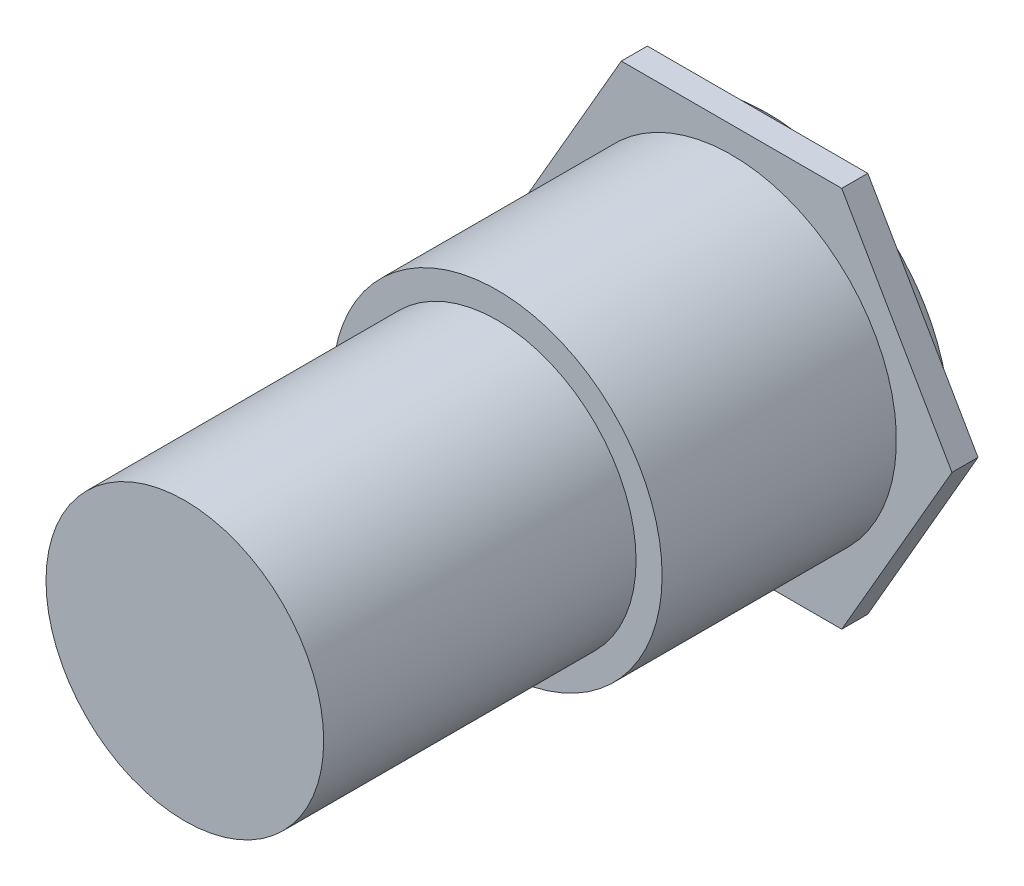
ISO-10303-21;
HEADER;
FILE_DESCRIPTION(('STEP AP214'),'2;1');
FILE_NAME('part.step','',(''),(''),'','','');
FILE_SCHEMA(('AUTOMOTIVE_DESIGN { 1 0 10303 214 1 1 1 1 }'));
ENDSEC;
DATA;
#1=APPLICATION_CONTEXT('core data for automotive mechanical design processes');
#2=APPLICATION_PROTOCOL_DEFINITION('international standard','automotive_design',2000,#1);
#3=PRODUCT_CONTEXT('',#1,'mechanical');
#4=PRODUCT('Part','Part','',(#3));
#5=PRODUCT_RELATED_PRODUCT_CATEGORY('part','',(#4));
#6=PRODUCT_DEFINITION_FORMATION('','',#4);
#7=PRODUCT_DEFINITION_CONTEXT('part definition',#1,'design');
#8=PRODUCT_DEFINITION('design','',#6,#7);
#9=PRODUCT_DEFINITION_SHAPE('','',#8);
#10=(LENGTH_UNIT() NAMED_UNIT(*) SI_UNIT(.MILLI.,.METRE.));
#11=(NAMED_UNIT(*) PLANE_ANGLE_UNIT() SI_UNIT($,.RADIAN.));
#12=(NAMED_UNIT(*) SI_UNIT($,.STERADIAN.) SOLID_ANGLE_UNIT());
#13=UNCERTAINTY_MEASURE_WITH_UNIT(LENGTH_MEASURE(1.E-05),#10,'distance_accuracy_value','');
#14=(GEOMETRIC_REPRESENTATION_CONTEXT(3) GLOBAL_UNCERTAINTY_ASSIGNED_CONTEXT((#13)) GLOBAL_UNIT_ASSIGNED_CONTEXT((#10,
#11,#12)) REPRESENTATION_CONTEXT('',''));
#15=CARTESIAN_POINT('',(0.,0.,0.));
#16=DIRECTION('',(0.,0.,1.));
#17=DIRECTION('',(1.,0.,0.));
#18=AXIS2_PLACEMENT_3D('',#15,#16,#17);
#19=CARTESIAN_POINT('',(0.,0.,0.));
#20=DIRECTION('',(0.,0.,1.));
#21=DIRECTION('',(1.,0.,0.));
#22=AXIS2_PLACEMENT_3D('',#19,#20,#21);
#23=PLANE('',#22);
#24=DIRECTION('',(0.5,-0.866025403784439,0.));
#25=VECTOR('',#24,1.);
#26=CARTESIAN_POINT('',(6.35085296108588,11.,0.));
#27=LINE('',#26,#25);
#28=CARTESIAN_POINT('',(6.35085296108588,11.,0.));
#29=VERTEX_POINT('',#28);
#30=CARTESIAN_POINT('',(9.52627944162882,5.49999999999999,0.));
#31=VERTEX_POINT('',#30);
#32=EDGE_CURVE('E154',#29,#31,#27,.T.);
#33=ORIENTED_EDGE('',*,*,#32,.T.);
#34=CARTESIAN_POINT('',(0.,0.,0.));
#35=DIRECTION('',(0.,0.,1.));
#36=DIRECTION('',(1.,0.,0.));
#37=AXIS2_PLACEMENT_3D('',#34,#35,#36);
#38=CIRCLE('',#37,11.);
#39=CARTESIAN_POINT('',(0.,11.,0.));
#40=VERTEX_POINT('',#39);
#41=EDGE_CURVE('E52',#31,#40,#38,.T.);
#42=ORIENTED_EDGE('',*,*,#41,.T.);
#43=DIRECTION('',(1.,0.,0.));
#44=VECTOR('',#43,1.);
#45=CARTESIAN_POINT('',(-6.35085296108588,11.,0.));
#46=LINE('',#45,#44);
#47=EDGE_CURVE('E148',#40,#29,#46,.T.);
#48=ORIENTED_EDGE('',*,*,#47,.T.);
#49=EDGE_LOOP('',(#33,#42,#48));
#50=FACE_BOUND('',#49,.T.);
#51=ADVANCED_FACE('F35',(#50),#23,.F.);
#52=CARTESIAN_POINT('',(-6.35085296108588,11.,0.));
#53=VERTEX_POINT('',#52);
#54=EDGE_CURVE('E150',#53,#40,#46,.T.);
#55=ORIENTED_EDGE('',*,*,#54,.T.);
#56=CARTESIAN_POINT('',(-9.52627944162882,5.5,0.));
#57=VERTEX_POINT('',#56);
#58=EDGE_CURVE('E44',#40,#57,#38,.T.);
#59=ORIENTED_EDGE('',*,*,#58,.T.);
#60=DIRECTION('',(0.5,0.866025403784439,0.));
#61=VECTOR('',#60,1.);
#62=CARTESIAN_POINT('',(-12.7017059221718,0.,0.));
#63=LINE('',#62,#61);
#64=EDGE_CURVE('E149',#57,#53,#63,.T.);
#65=ORIENTED_EDGE('',*,*,#64,.T.);
#66=EDGE_LOOP('',(#55,#59,#65));
#67=FACE_BOUND('',#66,.T.);
#68=ADVANCED_FACE('F239',(#67),#23,.F.);
#69=CARTESIAN_POINT('',(-12.7017059221718,0.,0.));
#70=VERTEX_POINT('',#69);
#71=EDGE_CURVE('E146',#70,#57,#63,.T.);
#72=ORIENTED_EDGE('',*,*,#71,.T.);
#73=CARTESIAN_POINT('',(-9.52627944162882,-5.5,0.));
#74=VERTEX_POINT('',#73);
#75=EDGE_CURVE('E196',#57,#74,#38,.T.);
#76=ORIENTED_EDGE('',*,*,#75,.T.);
#77=DIRECTION('',(-0.5,0.866025403784438,0.));
#78=VECTOR('',#77,1.);
#79=CARTESIAN_POINT('',(-6.35085296108588,-11.,0.));
#80=LINE('',#79,#78);
#81=EDGE_CURVE('E90',#74,#70,#80,.T.);
#82=ORIENTED_EDGE('',*,*,#81,.T.);
#83=EDGE_LOOP('',(#72,#76,#82));
#84=FACE_BOUND('',#83,.T.);
#85=ADVANCED_FACE('F243',(#84),#23,.F.);
#86=CARTESIAN_POINT('',(-6.35085296108588,-11.,0.));
#87=VERTEX_POINT('',#86);
#88=EDGE_CURVE('E163',#87,#74,#80,.T.);
#89=ORIENTED_EDGE('',*,*,#88,.T.);
#90=CARTESIAN_POINT('',(0.,-11.,0.));
#91=VERTEX_POINT('',#90);
#92=EDGE_CURVE('E186',#74,#91,#38,.T.);
#93=ORIENTED_EDGE('',*,*,#92,.T.);
#94=DIRECTION('',(-1.,0.,0.));
#95=VECTOR('',#94,1.);
#96=CARTESIAN_POINT('',(6.35085296108588,-11.,0.));
#97=LINE('',#96,#95);
#98=EDGE_CURVE('E161',#91,#87,#97,.T.);
#99=ORIENTED_EDGE('',*,*,#98,.T.);
#100=EDGE_LOOP('',(#89,#93,#99));
#101=FACE_BOUND('',#100,.T.);
#102=ADVANCED_FACE('F206',(#101),#23,.F.);
#103=CARTESIAN_POINT('',(6.35085296108588,-11.,0.));
#104=VERTEX_POINT('',#103);
#105=EDGE_CURVE('E120',#104,#91,#97,.T.);
#106=ORIENTED_EDGE('',*,*,#105,.T.);
#107=CARTESIAN_POINT('',(9.52627944162882,-5.5,0.));
#108=VERTEX_POINT('',#107);
#109=EDGE_CURVE('E181',#91,#108,#38,.T.);
#110=ORIENTED_EDGE('',*,*,#109,.T.);
#111=DIRECTION('',(-0.5,-0.866025403784439,0.));
#112=VECTOR('',#111,1.);
#113=CARTESIAN_POINT('',(12.7017059221718,0.,0.));
#114=LINE('',#113,#112);
#115=EDGE_CURVE('E157',#108,#104,#114,.T.);
#116=ORIENTED_EDGE('',*,*,#115,.T.);
#117=EDGE_LOOP('',(#106,#110,#116));
#118=FACE_BOUND('',#117,.T.);
#119=ADVANCED_FACE('F210',(#118),#23,.F.);
#120=CARTESIAN_POINT('',(0.,0.,15.));
#121=DIRECTION('',(0.,0.,-1.));
#122=DIRECTION('',(-1.,0.,0.));
#123=AXIS2_PLACEMENT_3D('',#120,#121,#122);
#124=CYLINDRICAL_SURFACE('',#123,9.5);
#125=CARTESIAN_POINT('',(0.,0.,15.));
#126=DIRECTION('',(0.,0.,1.));
#127=DIRECTION('',(1.,0.,0.));
#128=AXIS2_PLACEMENT_3D('',#125,#126,#127);
#129=CIRCLE('',#128,9.5);
#130=CARTESIAN_POINT('',(9.5,0.,15.));
#131=VERTEX_POINT('',#130);
#132=EDGE_CURVE('E168',#131,#131,#129,.T.);
#133=ORIENTED_EDGE('',*,*,#132,.F.);
#134=EDGE_LOOP('',(#133));
#135=FACE_BOUND('',#134,.T.);
#136=CARTESIAN_POINT('',(0.,0.,1.5));
#137=DIRECTION('',(0.,0.,-1.));
#138=DIRECTION('',(-1.,0.,0.));
#139=AXIS2_PLACEMENT_3D('',#136,#137,#138);
#140=CIRCLE('',#139,9.5);
#141=CARTESIAN_POINT('',(-9.5,0.,1.5));
#142=VERTEX_POINT('',#141);
#143=EDGE_CURVE('E39',#142,#142,#140,.T.);
#144=ORIENTED_EDGE('',*,*,#143,.F.);
#145=EDGE_LOOP('',(#144));
#146=FACE_BOUND('',#145,.T.);
#147=ADVANCED_FACE('F37',(#135,#146),#124,.T.);
#148=CARTESIAN_POINT('',(0.,0.,15.));
#149=DIRECTION('',(0.,0.,1.));
#150=DIRECTION('',(1.,0.,0.));
#151=AXIS2_PLACEMENT_3D('',#148,#149,#150);
#152=PLANE('',#151);
#153=CARTESIAN_POINT('',(0.,0.,15.));
#154=DIRECTION('',(0.,0.,1.));
#155=DIRECTION('',(1.,0.,0.));
#156=AXIS2_PLACEMENT_3D('',#153,#154,#155);
#157=CIRCLE('',#156,8.);
#158=CARTESIAN_POINT('',(8.,0.,15.));
#159=VERTEX_POINT('',#158);
#160=EDGE_CURVE('E11',#159,#159,#157,.T.);
#161=ORIENTED_EDGE('',*,*,#160,.F.);
#162=EDGE_LOOP('',(#161));
#163=FACE_BOUND('',#162,.T.);
#164=ORIENTED_EDGE('',*,*,#132,.T.);
#165=EDGE_LOOP('',(#164));
#166=FACE_BOUND('',#165,.T.);
#167=ADVANCED_FACE('F255',(#163,#166),#152,.T.);
#168=CARTESIAN_POINT('',(-12.7017059221718,0.,1.5));
#169=DIRECTION('',(-0.866025403784438,0.5,0.));
#170=DIRECTION('',(-0.5,-0.866025403784439,0.));
#171=AXIS2_PLACEMENT_3D('',#168,#169,#170);
#172=PLANE('',#171);
#173=ORIENTED_EDGE('',*,*,#71,.F.);
#174=DIRECTION('',(0.,0.,-1.));
#175=VECTOR('',#174,1.);
#176=CARTESIAN_POINT('',(-12.7017059221718,0.,1.5));
#177=LINE('',#176,#175);
#178=CARTESIAN_POINT('',(-12.7017059221718,0.,1.5));
#179=VERTEX_POINT('',#178);
#180=EDGE_CURVE('E61',#179,#70,#177,.T.);
#181=ORIENTED_EDGE('',*,*,#180,.F.);
#182=DIRECTION('',(0.5,0.866025403784439,0.));
#183=VECTOR('',#182,1.);
#184=CARTESIAN_POINT('',(-12.7017059221718,0.,1.5));
#185=LINE('',#184,#183);
#186=CARTESIAN_POINT('',(-6.35085296108588,11.,1.5));
#187=VERTEX_POINT('',#186);
#188=EDGE_CURVE('E166',#179,#187,#185,.T.);
#189=ORIENTED_EDGE('',*,*,#188,.T.);
#190=DIRECTION('',(0.,0.,-1.));
#191=VECTOR('',#190,1.);
#192=CARTESIAN_POINT('',(-6.35085296108588,11.,1.5));
#193=LINE('',#192,#191);
#194=EDGE_CURVE('E98',#187,#53,#193,.T.);
#195=ORIENTED_EDGE('',*,*,#194,.T.);
#196=ORIENTED_EDGE('',*,*,#64,.F.);
#197=EDGE_LOOP('',(#173,#181,#189,#195,#196));
#198=FACE_BOUND('',#197,.T.);
#199=ADVANCED_FACE('F216',(#198),#172,.T.);
#200=CARTESIAN_POINT('',(-6.35085296108588,-11.,1.5));
#201=DIRECTION('',(-0.866025403784439,-0.5,0.));
#202=DIRECTION('',(0.5,-0.866025403784439,0.));
#203=AXIS2_PLACEMENT_3D('',#200,#201,#202);
#204=PLANE('',#203);
#205=ORIENTED_EDGE('',*,*,#88,.F.);
#206=DIRECTION('',(0.,0.,-1.));
#207=VECTOR('',#206,1.);
#208=CARTESIAN_POINT('',(-6.35085296108588,-11.,1.5));
#209=LINE('',#208,#207);
#210=CARTESIAN_POINT('',(-6.35085296108588,-11.,1.5));
#211=VERTEX_POINT('',#210);
#212=EDGE_CURVE('E124',#211,#87,#209,.T.);
#213=ORIENTED_EDGE('',*,*,#212,.F.);
#214=DIRECTION('',(-0.5,0.866025403784438,0.));
#215=VECTOR('',#214,1.);
#216=CARTESIAN_POINT('',(-6.35085296108588,-11.,1.5));
#217=LINE('',#216,#215);
#218=EDGE_CURVE('E134',#211,#179,#217,.T.);
#219=ORIENTED_EDGE('',*,*,#218,.T.);
#220=ORIENTED_EDGE('',*,*,#180,.T.);
#221=ORIENTED_EDGE('',*,*,#81,.F.);
#222=EDGE_LOOP('',(#205,#213,#219,#220,#221));
#223=FACE_BOUND('',#222,.T.);
#224=ADVANCED_FACE('F218',(#223),#204,.T.);
#225=CARTESIAN_POINT('',(6.35085296108588,-11.,1.5));
#226=DIRECTION('',(0.,-1.,0.));
#227=DIRECTION('',(1.,0.,0.));
#228=AXIS2_PLACEMENT_3D('',#225,#226,#227);
#229=PLANE('',#228);
#230=ORIENTED_EDGE('',*,*,#105,.F.);
#231=DIRECTION('',(0.,0.,-1.));
#232=VECTOR('',#231,1.);
#233=CARTESIAN_POINT('',(6.35085296108588,-11.,1.5));
#234=LINE('',#233,#232);
#235=CARTESIAN_POINT('',(6.35085296108588,-11.,1.5));
#236=VERTEX_POINT('',#235);
#237=EDGE_CURVE('E112',#236,#104,#234,.T.);
#238=ORIENTED_EDGE('',*,*,#237,.F.);
#239=DIRECTION('',(-1.,0.,0.));
#240=VECTOR('',#239,1.);
#241=CARTESIAN_POINT('',(6.35085296108588,-11.,1.5));
#242=LINE('',#241,#240);
#243=EDGE_CURVE('E116',#236,#211,#242,.T.);
#244=ORIENTED_EDGE('',*,*,#243,.T.);
#245=ORIENTED_EDGE('',*,*,#212,.T.);
#246=ORIENTED_EDGE('',*,*,#98,.F.);
#247=EDGE_LOOP('',(#230,#238,#244,#245,#246));
#248=FACE_BOUND('',#247,.T.);
#249=ADVANCED_FACE('F114',(#248),#229,.T.);
#250=CARTESIAN_POINT('',(12.7017059221718,0.,1.5));
#251=DIRECTION('',(0.866025403784438,-0.5,0.));
#252=DIRECTION('',(0.5,0.866025403784439,0.));
#253=AXIS2_PLACEMENT_3D('',#250,#251,#252);
#254=PLANE('',#253);
#255=CARTESIAN_POINT('',(12.7017059221718,0.,0.));
#256=VERTEX_POINT('',#255);
#257=EDGE_CURVE('E158',#256,#108,#114,.T.);
#258=ORIENTED_EDGE('',*,*,#257,.F.);
#259=DIRECTION('',(0.,0.,-1.));
#260=VECTOR('',#259,1.);
#261=CARTESIAN_POINT('',(12.7017059221718,0.,1.5));
#262=LINE('',#261,#260);
#263=CARTESIAN_POINT('',(12.7017059221718,0.,1.5));
#264=VERTEX_POINT('',#263);
#265=EDGE_CURVE('E125',#264,#256,#262,.T.);
#266=ORIENTED_EDGE('',*,*,#265,.F.);
#267=DIRECTION('',(-0.5,-0.866025403784439,0.));
#268=VECTOR('',#267,1.);
#269=CARTESIAN_POINT('',(12.7017059221718,0.,1.5));
#270=LINE('',#269,#268);
#271=EDGE_CURVE('E131',#264,#236,#270,.T.);
#272=ORIENTED_EDGE('',*,*,#271,.T.);
#273=ORIENTED_EDGE('',*,*,#237,.T.);
#274=ORIENTED_EDGE('',*,*,#115,.F.);
#275=EDGE_LOOP('',(#258,#266,#272,#273,#274));
#276=FACE_BOUND('',#275,.T.);
#277=ADVANCED_FACE('F137',(#276),#254,.T.);
#278=CARTESIAN_POINT('',(6.35085296108588,11.,1.5));
#279=DIRECTION('',(0.866025403784439,0.5,0.));
#280=DIRECTION('',(-0.5,0.866025403784439,0.));
#281=AXIS2_PLACEMENT_3D('',#278,#279,#280);
#282=PLANE('',#281);
#283=ORIENTED_EDGE('',*,*,#32,.F.);
#284=DIRECTION('',(0.,0.,-1.));
#285=VECTOR('',#284,1.);
#286=CARTESIAN_POINT('',(6.35085296108588,11.,1.5));
#287=LINE('',#286,#285);
#288=CARTESIAN_POINT('',(6.35085296108588,11.,1.5));
#289=VERTEX_POINT('',#288);
#290=EDGE_CURVE('E171',#289,#29,#287,.T.);
#291=ORIENTED_EDGE('',*,*,#290,.F.);
#292=DIRECTION('',(0.5,-0.866025403784439,0.));
#293=VECTOR('',#292,1.);
#294=CARTESIAN_POINT('',(6.35085296108588,11.,1.5));
#295=LINE('',#294,#293);
#296=EDGE_CURVE('E139',#289,#264,#295,.T.);
#297=ORIENTED_EDGE('',*,*,#296,.T.);
#298=ORIENTED_EDGE('',*,*,#265,.T.);
#299=EDGE_CURVE('E153',#31,#256,#27,.T.);
#300=ORIENTED_EDGE('',*,*,#299,.F.);
#301=EDGE_LOOP('',(#283,#291,#297,#298,#300));
#302=FACE_BOUND('',#301,.T.);
#303=ADVANCED_FACE('F214',(#302),#282,.T.);
#304=CARTESIAN_POINT('',(-6.35085296108588,11.,1.5));
#305=DIRECTION('',(0.,1.,0.));
#306=DIRECTION('',(0.,0.,1.));
#307=AXIS2_PLACEMENT_3D('',#304,#305,#306);
#308=PLANE('',#307);
#309=ORIENTED_EDGE('',*,*,#54,.F.);
#310=ORIENTED_EDGE('',*,*,#194,.F.);
#311=DIRECTION('',(1.,0.,0.));
#312=VECTOR('',#311,1.);
#313=CARTESIAN_POINT('',(-6.35085296108588,11.,1.5));
#314=LINE('',#313,#312);
#315=EDGE_CURVE('E141',#187,#289,#314,.T.);
#316=ORIENTED_EDGE('',*,*,#315,.T.);
#317=ORIENTED_EDGE('',*,*,#290,.T.);
#318=ORIENTED_EDGE('',*,*,#47,.F.);
#319=EDGE_LOOP('',(#309,#310,#316,#317,#318));
#320=FACE_BOUND('',#319,.T.);
#321=ADVANCED_FACE('F215',(#320),#308,.T.);
#322=CARTESIAN_POINT('',(0.,0.,1.5));
#323=DIRECTION('',(0.,0.,-1.));
#324=DIRECTION('',(-1.,0.,0.));
#325=AXIS2_PLACEMENT_3D('',#322,#323,#324);
#326=PLANE('',#325);
#327=ORIENTED_EDGE('',*,*,#143,.T.);
#328=EDGE_LOOP('',(#327));
#329=FACE_BOUND('',#328,.T.);
#330=ORIENTED_EDGE('',*,*,#188,.F.);
#331=ORIENTED_EDGE('',*,*,#218,.F.);
#332=ORIENTED_EDGE('',*,*,#243,.F.);
#333=ORIENTED_EDGE('',*,*,#271,.F.);
#334=ORIENTED_EDGE('',*,*,#296,.F.);
#335=ORIENTED_EDGE('',*,*,#315,.F.);
#336=EDGE_LOOP('',(#330,#331,#332,#333,#334,#335));
#337=FACE_BOUND('',#336,.T.);
#338=ADVANCED_FACE('F129',(#329,#337),#326,.F.);
#339=ORIENTED_EDGE('',*,*,#257,.T.);
#340=EDGE_CURVE('E178',#108,#31,#38,.T.);
#341=ORIENTED_EDGE('',*,*,#340,.T.);
#342=ORIENTED_EDGE('',*,*,#299,.T.);
#343=EDGE_LOOP('',(#339,#341,#342));
#344=FACE_BOUND('',#343,.T.);
#345=ADVANCED_FACE('F211',(#344),#23,.F.);
#346=CARTESIAN_POINT('',(0.,0.,1.78867149138609));
#347=DIRECTION('',(0.,0.,1.));
#348=DIRECTION('',(1.,0.,0.));
#349=AXIS2_PLACEMENT_3D('',#346,#347,#348);
#350=TOROIDAL_SURFACE('',#349,8.22679710516834,3.3);
#351=ORIENTED_EDGE('',*,*,#41,.F.);
#352=ORIENTED_EDGE('',*,*,#340,.F.);
#353=ORIENTED_EDGE('',*,*,#109,.F.);
#354=ORIENTED_EDGE('',*,*,#92,.F.);
#355=ORIENTED_EDGE('',*,*,#75,.F.);
#356=ORIENTED_EDGE('',*,*,#58,.F.);
#357=EDGE_LOOP('',(#351,#352,#353,#354,#355,#356));
#358=FACE_BOUND('',#357,.T.);
#359=CARTESIAN_POINT('',(0.,0.,-1.5));
#360=DIRECTION('',(0.,0.,1.));
#361=DIRECTION('',(1.,0.,0.));
#362=AXIS2_PLACEMENT_3D('',#359,#360,#361);
#363=CIRCLE('',#362,8.5);
#364=CARTESIAN_POINT('',(8.5,0.,-1.5));
#365=VERTEX_POINT('',#364);
#366=EDGE_CURVE('E189',#365,#365,#363,.T.);
#367=ORIENTED_EDGE('',*,*,#366,.T.);
#368=EDGE_LOOP('',(#367));
#369=FACE_BOUND('',#368,.T.);
#370=ADVANCED_FACE('F222',(#358,#369),#350,.T.);
#371=CARTESIAN_POINT('',(0.,0.,-1.5));
#372=DIRECTION('',(0.,0.,1.));
#373=DIRECTION('',(1.,0.,0.));
#374=AXIS2_PLACEMENT_3D('',#371,#372,#373);
#375=PLANE('',#374);
#376=ORIENTED_EDGE('',*,*,#366,.F.);
#377=EDGE_LOOP('',(#376));
#378=FACE_BOUND('',#377,.T.);
#379=ADVANCED_FACE('F225',(#378),#375,.F.);
#380=CARTESIAN_POINT('',(0.,0.,33.));
#381=DIRECTION('',(0.,0.,-1.));
#382=DIRECTION('',(-1.,0.,0.));
#383=AXIS2_PLACEMENT_3D('',#380,#381,#382);
#384=CYLINDRICAL_SURFACE('',#383,8.);
#385=CARTESIAN_POINT('',(0.,0.,33.));
#386=DIRECTION('',(0.,0.,1.));
#387=DIRECTION('',(1.,0.,0.));
#388=AXIS2_PLACEMENT_3D('',#385,#386,#387);
#389=CIRCLE('',#388,8.);
#390=CARTESIAN_POINT('',(8.,0.,33.));
#391=VERTEX_POINT('',#390);
#392=EDGE_CURVE('E194',#391,#391,#389,.T.);
#393=ORIENTED_EDGE('',*,*,#392,.F.);
#394=EDGE_LOOP('',(#393));
#395=FACE_BOUND('',#394,.T.);
#396=ORIENTED_EDGE('',*,*,#160,.T.);
#397=EDGE_LOOP('',(#396));
#398=FACE_BOUND('',#397,.T.);
#399=ADVANCED_FACE('F230',(#395,#398),#384,.T.);
#400=CARTESIAN_POINT('',(0.,0.,33.));
#401=DIRECTION('',(0.,0.,1.));
#402=DIRECTION('',(1.,0.,0.));
#403=AXIS2_PLACEMENT_3D('',#400,#401,#402);
#404=PLANE('',#403);
#405=ORIENTED_EDGE('',*,*,#392,.T.);
#406=EDGE_LOOP('',(#405));
#407=FACE_BOUND('',#406,.T.);
#408=ADVANCED_FACE('F235',(#407),#404,.T.);
#409=CLOSED_SHELL('',(#51,#68,#85,#102,#119,#147,#167,#199,#224,#249,#277,#303,#321,#338,#345,
#370,#379,#399,#408));
#410=MANIFOLD_SOLID_BREP('B2',#409);
#411=ADVANCED_BREP_SHAPE_REPRESENTATION('',(#18,#410),#14);
#412=SHAPE_DEFINITION_REPRESENTATION(#9,#411);
ENDSEC;
END-ISO-10303-21;
